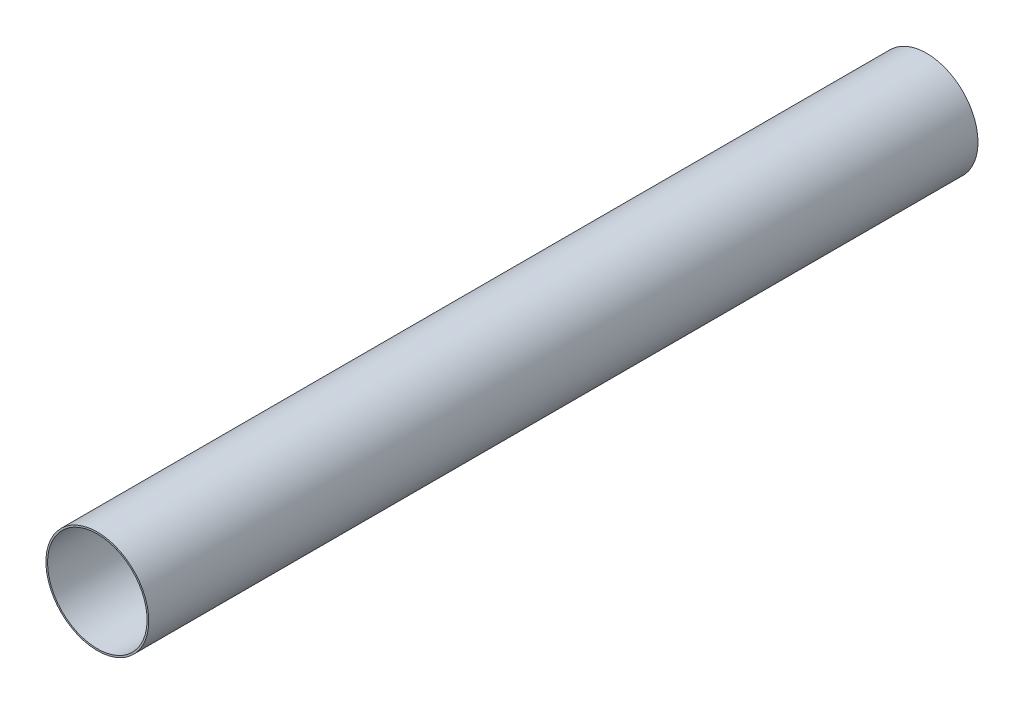
ISO-10303-21;
HEADER;
FILE_DESCRIPTION(('STEP AP214'),'2;1');
FILE_NAME('part.step','',(''),(''),'','','');
FILE_SCHEMA(('AUTOMOTIVE_DESIGN { 1 0 10303 214 1 1 1 1 }'));
ENDSEC;
DATA;
#1=APPLICATION_CONTEXT('core data for automotive mechanical design processes');
#2=APPLICATION_PROTOCOL_DEFINITION('international standard','automotive_design',2000,#1);
#3=PRODUCT_CONTEXT('',#1,'mechanical');
#4=PRODUCT('Part','Part','',(#3));
#5=PRODUCT_RELATED_PRODUCT_CATEGORY('part','',(#4));
#6=PRODUCT_DEFINITION_FORMATION('','',#4);
#7=PRODUCT_DEFINITION_CONTEXT('part definition',#1,'design');
#8=PRODUCT_DEFINITION('design','',#6,#7);
#9=PRODUCT_DEFINITION_SHAPE('','',#8);
#10=(LENGTH_UNIT() NAMED_UNIT(*) SI_UNIT(.MILLI.,.METRE.));
#11=(NAMED_UNIT(*) PLANE_ANGLE_UNIT() SI_UNIT($,.RADIAN.));
#12=(NAMED_UNIT(*) SI_UNIT($,.STERADIAN.) SOLID_ANGLE_UNIT());
#13=UNCERTAINTY_MEASURE_WITH_UNIT(LENGTH_MEASURE(1.E-05),#10,'distance_accuracy_value','');
#14=(GEOMETRIC_REPRESENTATION_CONTEXT(3) GLOBAL_UNCERTAINTY_ASSIGNED_CONTEXT((#13)) GLOBAL_UNIT_ASSIGNED_CONTEXT((#10,
#11,#12)) REPRESENTATION_CONTEXT('',''));
#15=CARTESIAN_POINT('',(0.,0.,0.));
#16=DIRECTION('',(0.,0.,1.));
#17=DIRECTION('',(1.,0.,0.));
#18=AXIS2_PLACEMENT_3D('',#15,#16,#17);
#19=CARTESIAN_POINT('',(0.,0.,500.));
#20=DIRECTION('',(0.,0.,1.));
#21=DIRECTION('',(1.,0.,0.));
#22=AXIS2_PLACEMENT_3D('',#19,#20,#21);
#23=PLANE('',#22);
#24=CARTESIAN_POINT('',(0.,0.,500.));
#25=DIRECTION('',(0.,0.,1.));
#26=DIRECTION('',(1.,0.,0.));
#27=AXIS2_PLACEMENT_3D('',#24,#25,#26);
#28=CIRCLE('',#27,31.);
#29=CARTESIAN_POINT('',(31.,0.,500.));
#30=VERTEX_POINT('',#29);
#31=EDGE_CURVE('E11',#30,#30,#28,.T.);
#32=ORIENTED_EDGE('',*,*,#31,.T.);
#33=EDGE_LOOP('',(#32));
#34=FACE_BOUND('',#33,.T.);
#35=CARTESIAN_POINT('',(0.,0.,500.));
#36=DIRECTION('',(0.,0.,1.));
#37=DIRECTION('',(0.,1.,0.));
#38=AXIS2_PLACEMENT_3D('',#35,#36,#37);
#39=CIRCLE('',#38,30.);
#40=CARTESIAN_POINT('',(0.,30.,500.));
#41=VERTEX_POINT('',#40);
#42=EDGE_CURVE('E62',#41,#41,#39,.T.);
#43=ORIENTED_EDGE('',*,*,#42,.F.);
#44=EDGE_LOOP('',(#43));
#45=FACE_BOUND('',#44,.T.);
#46=ADVANCED_FACE('F49',(#34,#45),#23,.T.);
#47=CARTESIAN_POINT('',(0.,0.,0.));
#48=DIRECTION('',(0.,0.,1.));
#49=DIRECTION('',(1.,0.,0.));
#50=AXIS2_PLACEMENT_3D('',#47,#48,#49);
#51=PLANE('',#50);
#52=CARTESIAN_POINT('',(0.,0.,0.));
#53=DIRECTION('',(0.,0.,1.));
#54=DIRECTION('',(1.,0.,0.));
#55=AXIS2_PLACEMENT_3D('',#52,#53,#54);
#56=CIRCLE('',#55,31.);
#57=CARTESIAN_POINT('',(31.,0.,0.));
#58=VERTEX_POINT('',#57);
#59=EDGE_CURVE('E53',#58,#58,#56,.T.);
#60=ORIENTED_EDGE('',*,*,#59,.F.);
#61=EDGE_LOOP('',(#60));
#62=FACE_BOUND('',#61,.T.);
#63=CARTESIAN_POINT('',(0.,0.,0.));
#64=DIRECTION('',(0.,0.,1.));
#65=DIRECTION('',(0.,1.,0.));
#66=AXIS2_PLACEMENT_3D('',#63,#64,#65);
#67=CIRCLE('',#66,30.);
#68=CARTESIAN_POINT('',(0.,30.,0.));
#69=VERTEX_POINT('',#68);
#70=EDGE_CURVE('E64',#69,#69,#67,.T.);
#71=ORIENTED_EDGE('',*,*,#70,.T.);
#72=EDGE_LOOP('',(#71));
#73=FACE_BOUND('',#72,.T.);
#74=ADVANCED_FACE('F76',(#62,#73),#51,.F.);
#75=CARTESIAN_POINT('',(0.,0.,500.));
#76=DIRECTION('',(0.,0.,-1.));
#77=DIRECTION('',(-1.,0.,0.));
#78=AXIS2_PLACEMENT_3D('',#75,#76,#77);
#79=CYLINDRICAL_SURFACE('',#78,31.);
#80=ORIENTED_EDGE('',*,*,#31,.F.);
#81=EDGE_LOOP('',(#80));
#82=FACE_BOUND('',#81,.T.);
#83=ORIENTED_EDGE('',*,*,#59,.T.);
#84=EDGE_LOOP('',(#83));
#85=FACE_BOUND('',#84,.T.);
#86=ADVANCED_FACE('F51',(#82,#85),#79,.T.);
#87=CARTESIAN_POINT('',(0.,0.,500.));
#88=DIRECTION('',(0.,0.,-1.));
#89=DIRECTION('',(-1.,0.,0.));
#90=AXIS2_PLACEMENT_3D('',#87,#88,#89);
#91=CYLINDRICAL_SURFACE('',#90,30.);
#92=ORIENTED_EDGE('',*,*,#42,.T.);
#93=EDGE_LOOP('',(#92));
#94=FACE_BOUND('',#93,.T.);
#95=ORIENTED_EDGE('',*,*,#70,.F.);
#96=EDGE_LOOP('',(#95));
#97=FACE_BOUND('',#96,.T.);
#98=ADVANCED_FACE('F72',(#94,#97),#91,.F.);
#99=CLOSED_SHELL('',(#46,#74,#86,#98));
#100=MANIFOLD_SOLID_BREP('B2',#99);
#101=ADVANCED_BREP_SHAPE_REPRESENTATION('',(#18,#100),#14);
#102=SHAPE_DEFINITION_REPRESENTATION(#9,#101);
ENDSEC;
END-ISO-10303-21;
